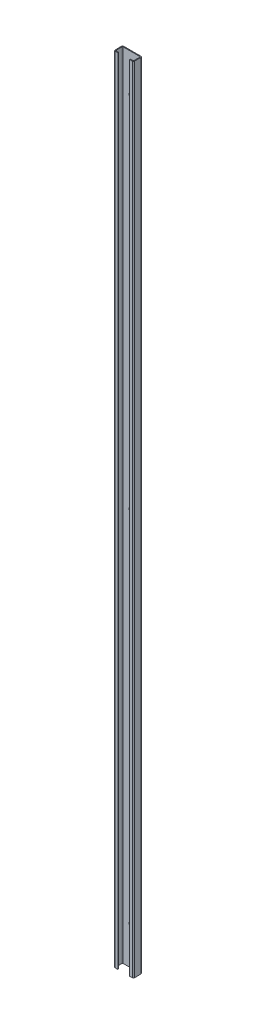
ISO-10303-21;
HEADER;
FILE_DESCRIPTION(('STEP AP214'),'2;1');
FILE_NAME('part.step','',(''),(''),'','','');
FILE_SCHEMA(('AUTOMOTIVE_DESIGN { 1 0 10303 214 1 1 1 1 }'));
ENDSEC;
DATA;
#1=APPLICATION_CONTEXT('core data for automotive mechanical design processes');
#2=APPLICATION_PROTOCOL_DEFINITION('international standard','automotive_design',2000,#1);
#3=PRODUCT_CONTEXT('',#1,'mechanical');
#4=PRODUCT('Part','Part','',(#3));
#5=PRODUCT_RELATED_PRODUCT_CATEGORY('part','',(#4));
#6=PRODUCT_DEFINITION_FORMATION('','',#4);
#7=PRODUCT_DEFINITION_CONTEXT('part definition',#1,'design');
#8=PRODUCT_DEFINITION('design','',#6,#7);
#9=PRODUCT_DEFINITION_SHAPE('','',#8);
#10=(LENGTH_UNIT() NAMED_UNIT(*) SI_UNIT(.MILLI.,.METRE.));
#11=(NAMED_UNIT(*) PLANE_ANGLE_UNIT() SI_UNIT($,.RADIAN.));
#12=(NAMED_UNIT(*) SI_UNIT($,.STERADIAN.) SOLID_ANGLE_UNIT());
#13=UNCERTAINTY_MEASURE_WITH_UNIT(LENGTH_MEASURE(1.E-05),#10,'distance_accuracy_value','');
#14=(GEOMETRIC_REPRESENTATION_CONTEXT(3) GLOBAL_UNCERTAINTY_ASSIGNED_CONTEXT((#13)) GLOBAL_UNIT_ASSIGNED_CONTEXT((#10,
#11,#12)) REPRESENTATION_CONTEXT('',''));
#15=CARTESIAN_POINT('',(0.,0.,0.));
#16=DIRECTION('',(0.,0.,1.));
#17=DIRECTION('',(1.,0.,0.));
#18=AXIS2_PLACEMENT_3D('',#15,#16,#17);
#19=CARTESIAN_POINT('',(25.,1023.5,22.));
#20=DIRECTION('',(0.,1.,0.));
#21=DIRECTION('',(-1.,0.,0.));
#22=AXIS2_PLACEMENT_3D('',#19,#20,#21);
#23=PLANE('',#22);
#24=DIRECTION('',(0.,0.,-1.));
#25=VECTOR('',#24,1.);
#26=CARTESIAN_POINT('',(22.9999999999999,1023.5,0.));
#27=LINE('',#26,#25);
#28=CARTESIAN_POINT('',(22.9999999999999,1023.5,19.));
#29=VERTEX_POINT('',#28);
#30=CARTESIAN_POINT('',(23.0000000000001,1023.5,3.00000000000004));
#31=VERTEX_POINT('',#30);
#32=EDGE_CURVE('E427',#29,#31,#27,.T.);
#33=ORIENTED_EDGE('',*,*,#32,.F.);
#34=DIRECTION('',(1.,0.,0.));
#35=VECTOR('',#34,1.);
#36=CARTESIAN_POINT('',(23.0000000000001,1023.5,19.));
#37=LINE('',#36,#35);
#38=CARTESIAN_POINT('',(25.0000000000001,1023.5,19.));
#39=VERTEX_POINT('',#38);
#40=EDGE_CURVE('E313',#29,#39,#37,.T.);
#41=ORIENTED_EDGE('',*,*,#40,.T.);
#42=DIRECTION('',(0.,0.,1.));
#43=VECTOR('',#42,1.);
#44=CARTESIAN_POINT('',(25.,1023.5,22.));
#45=LINE('',#44,#43);
#46=CARTESIAN_POINT('',(24.9999999999999,1023.5,3.00000000000007));
#47=VERTEX_POINT('',#46);
#48=EDGE_CURVE('E421',#39,#47,#45,.F.);
#49=ORIENTED_EDGE('',*,*,#48,.T.);
#50=DIRECTION('',(1.,0.,0.));
#51=VECTOR('',#50,1.);
#52=CARTESIAN_POINT('',(22.9999999999999,1023.5,3.00000000000007));
#53=LINE('',#52,#51);
#54=EDGE_CURVE('E433',#31,#47,#53,.T.);
#55=ORIENTED_EDGE('',*,*,#54,.F.);
#56=EDGE_LOOP('',(#33,#41,#49,#55));
#57=FACE_BOUND('',#56,.T.);
#58=ADVANCED_FACE('F119',(#57),#23,.T.);
#59=CARTESIAN_POINT('',(25.,0.,0.));
#60=DIRECTION('',(-1.,0.,0.));
#61=DIRECTION('',(0.,0.,1.));
#62=AXIS2_PLACEMENT_3D('',#59,#60,#61);
#63=PLANE('',#62);
#64=DIRECTION('',(0.,1.,0.));
#65=VECTOR('',#64,1.);
#66=CARTESIAN_POINT('',(25.0000000000001,1023.5,19.));
#67=LINE('',#66,#65);
#68=CARTESIAN_POINT('',(25.0000000000002,-1023.5,19.));
#69=VERTEX_POINT('',#68);
#70=EDGE_CURVE('E266',#39,#69,#67,.F.);
#71=ORIENTED_EDGE('',*,*,#70,.T.);
#72=DIRECTION('',(0.,0.,-1.));
#73=VECTOR('',#72,1.);
#74=CARTESIAN_POINT('',(25.0000000000001,-1023.5,1.99999999999999));
#75=LINE('',#74,#73);
#76=CARTESIAN_POINT('',(25.0000000000001,-1023.5,3.00000000000003));
#77=VERTEX_POINT('',#76);
#78=EDGE_CURVE('E424',#77,#69,#75,.F.);
#79=ORIENTED_EDGE('',*,*,#78,.F.);
#80=DIRECTION('',(0.,1.,0.));
#81=VECTOR('',#80,1.);
#82=CARTESIAN_POINT('',(25.0000000000001,-1023.5,2.99999999999999));
#83=LINE('',#82,#81);
#84=EDGE_CURVE('E431',#47,#77,#83,.F.);
#85=ORIENTED_EDGE('',*,*,#84,.F.);
#86=ORIENTED_EDGE('',*,*,#48,.F.);
#87=EDGE_LOOP('',(#71,#79,#85,#86));
#88=FACE_BOUND('',#87,.T.);
#89=ADVANCED_FACE('F549',(#88),#63,.F.);
#90=CARTESIAN_POINT('',(23.,0.,0.));
#91=DIRECTION('',(-1.,0.,0.));
#92=DIRECTION('',(0.,0.,1.));
#93=AXIS2_PLACEMENT_3D('',#90,#91,#92);
#94=PLANE('',#93);
#95=DIRECTION('',(0.,0.,1.));
#96=VECTOR('',#95,1.);
#97=CARTESIAN_POINT('',(23.0000000000001,-1023.5,0.));
#98=LINE('',#97,#96);
#99=CARTESIAN_POINT('',(23.0000000000001,-1023.5,3.00000000000004));
#100=VERTEX_POINT('',#99);
#101=CARTESIAN_POINT('',(23.0000000000001,-1023.5,19.));
#102=VERTEX_POINT('',#101);
#103=EDGE_CURVE('E429',#100,#102,#98,.T.);
#104=ORIENTED_EDGE('',*,*,#103,.T.);
#105=DIRECTION('',(0.,1.,0.));
#106=VECTOR('',#105,1.);
#107=CARTESIAN_POINT('',(23.0000000000001,1023.5,19.));
#108=LINE('',#107,#106);
#109=EDGE_CURVE('E136',#29,#102,#108,.F.);
#110=ORIENTED_EDGE('',*,*,#109,.F.);
#111=ORIENTED_EDGE('',*,*,#32,.T.);
#112=DIRECTION('',(0.,1.,0.));
#113=VECTOR('',#112,1.);
#114=CARTESIAN_POINT('',(23.0000000000001,-1023.5,3.));
#115=LINE('',#114,#113);
#116=EDGE_CURVE('E436',#100,#31,#115,.T.);
#117=ORIENTED_EDGE('',*,*,#116,.F.);
#118=EDGE_LOOP('',(#104,#110,#111,#117));
#119=FACE_BOUND('',#118,.T.);
#120=ADVANCED_FACE('F555',(#119),#94,.T.);
#121=CARTESIAN_POINT('',(-24.9999999999999,-1023.5,1.99999999999999));
#122=DIRECTION('',(0.,-1.,0.));
#123=DIRECTION('',(1.,0.,0.));
#124=AXIS2_PLACEMENT_3D('',#121,#122,#123);
#125=PLANE('',#124);
#126=DIRECTION('',(0.,0.,1.));
#127=VECTOR('',#126,1.);
#128=CARTESIAN_POINT('',(-22.9999999999999,-1023.5,0.));
#129=LINE('',#128,#127);
#130=CARTESIAN_POINT('',(-23.0000000000002,-1023.5,19.));
#131=VERTEX_POINT('',#130);
#132=CARTESIAN_POINT('',(-23.0000000000001,-1023.5,3.00000000000004));
#133=VERTEX_POINT('',#132);
#134=EDGE_CURVE('E385',#131,#133,#129,.F.);
#135=ORIENTED_EDGE('',*,*,#134,.F.);
#136=DIRECTION('',(-1.,0.,-1.28369537222268E-13));
#137=VECTOR('',#136,1.);
#138=CARTESIAN_POINT('',(-23.0000000000002,-1023.5,19.));
#139=LINE('',#138,#137);
#140=CARTESIAN_POINT('',(-25.0000000000002,-1023.5,18.9999999999998));
#141=VERTEX_POINT('',#140);
#142=EDGE_CURVE('E361',#131,#141,#139,.T.);
#143=ORIENTED_EDGE('',*,*,#142,.T.);
#144=DIRECTION('',(0.,0.,-1.));
#145=VECTOR('',#144,1.);
#146=CARTESIAN_POINT('',(-24.9999999999999,-1023.5,1.99999999999999));
#147=LINE('',#146,#145);
#148=CARTESIAN_POINT('',(-24.9999999999999,-1023.5,3.00000000000008));
#149=VERTEX_POINT('',#148);
#150=EDGE_CURVE('E380',#141,#149,#147,.T.);
#151=ORIENTED_EDGE('',*,*,#150,.T.);
#152=DIRECTION('',(-1.,0.,0.));
#153=VECTOR('',#152,1.);
#154=CARTESIAN_POINT('',(-22.9999999999999,-1023.5,3.00000000000009));
#155=LINE('',#154,#153);
#156=EDGE_CURVE('E390',#133,#149,#155,.T.);
#157=ORIENTED_EDGE('',*,*,#156,.F.);
#158=EDGE_LOOP('',(#135,#143,#151,#157));
#159=FACE_BOUND('',#158,.T.);
#160=ADVANCED_FACE('F510',(#159),#125,.T.);
#161=CARTESIAN_POINT('',(-25.,0.,0.));
#162=DIRECTION('',(-1.,0.,0.));
#163=DIRECTION('',(0.,0.,1.));
#164=AXIS2_PLACEMENT_3D('',#161,#162,#163);
#165=PLANE('',#164);
#166=ORIENTED_EDGE('',*,*,#150,.F.);
#167=DIRECTION('',(0.,-1.,0.));
#168=VECTOR('',#167,1.);
#169=CARTESIAN_POINT('',(-25.0000000000002,-1023.5,18.9999999999998));
#170=LINE('',#169,#168);
#171=CARTESIAN_POINT('',(-25.0000000000002,1023.5,19.));
#172=VERTEX_POINT('',#171);
#173=EDGE_CURVE('E356',#141,#172,#170,.F.);
#174=ORIENTED_EDGE('',*,*,#173,.T.);
#175=DIRECTION('',(0.,0.,1.));
#176=VECTOR('',#175,1.);
#177=CARTESIAN_POINT('',(-25.0000000000002,1023.5,22.0000000000002));
#178=LINE('',#177,#176);
#179=CARTESIAN_POINT('',(-25.0000000000001,1023.5,3.00000000000004));
#180=VERTEX_POINT('',#179);
#181=EDGE_CURVE('E376',#180,#172,#178,.T.);
#182=ORIENTED_EDGE('',*,*,#181,.F.);
#183=DIRECTION('',(0.,-1.,0.));
#184=VECTOR('',#183,1.);
#185=CARTESIAN_POINT('',(-25.,0.,3.00000000000004));
#186=LINE('',#185,#184);
#187=EDGE_CURVE('E387',#180,#149,#186,.T.);
#188=ORIENTED_EDGE('',*,*,#187,.T.);
#189=EDGE_LOOP('',(#166,#174,#182,#188));
#190=FACE_BOUND('',#189,.T.);
#191=ADVANCED_FACE('F502',(#190),#165,.T.);
#192=CARTESIAN_POINT('',(-23.,0.,0.));
#193=DIRECTION('',(-1.,0.,0.));
#194=DIRECTION('',(0.,0.,1.));
#195=AXIS2_PLACEMENT_3D('',#192,#193,#194);
#196=PLANE('',#195);
#197=DIRECTION('',(0.,-1.,0.));
#198=VECTOR('',#197,1.);
#199=CARTESIAN_POINT('',(-23.0000000000002,-1023.5,19.));
#200=LINE('',#199,#198);
#201=CARTESIAN_POINT('',(-23.0000000000002,1023.5,19.));
#202=VERTEX_POINT('',#201);
#203=EDGE_CURVE('E367',#131,#202,#200,.F.);
#204=ORIENTED_EDGE('',*,*,#203,.F.);
#205=ORIENTED_EDGE('',*,*,#134,.T.);
#206=DIRECTION('',(0.,1.,0.));
#207=VECTOR('',#206,1.);
#208=CARTESIAN_POINT('',(-23.0000000000001,1023.5,3.));
#209=LINE('',#208,#207);
#210=CARTESIAN_POINT('',(-23.0000000000001,1023.5,3.00000000000004));
#211=VERTEX_POINT('',#210);
#212=EDGE_CURVE('E393',#211,#133,#209,.F.);
#213=ORIENTED_EDGE('',*,*,#212,.F.);
#214=DIRECTION('',(0.,0.,-1.));
#215=VECTOR('',#214,1.);
#216=CARTESIAN_POINT('',(-23.0000000000001,1023.5,0.));
#217=LINE('',#216,#215);
#218=EDGE_CURVE('E382',#211,#202,#217,.F.);
#219=ORIENTED_EDGE('',*,*,#218,.T.);
#220=EDGE_LOOP('',(#204,#205,#213,#219));
#221=FACE_BOUND('',#220,.T.);
#222=ADVANCED_FACE('F513',(#221),#196,.F.);
#223=CARTESIAN_POINT('',(25.0000000000001,-1023.5,2.));
#224=DIRECTION('',(0.,1.,0.));
#225=DIRECTION('',(0.,0.,1.));
#226=AXIS2_PLACEMENT_3D('',#223,#224,#225);
#227=PLANE('',#226);
#228=DIRECTION('',(1.24900090270314E-13,0.,-1.));
#229=VECTOR('',#228,1.);
#230=CARTESIAN_POINT('',(-21.9999999999999,-1023.5,1.99999999999992));
#231=LINE('',#230,#229);
#232=CARTESIAN_POINT('',(-21.9999999999999,-1023.5,1.99999999999992));
#233=VERTEX_POINT('',#232);
#234=CARTESIAN_POINT('',(-21.9999999999996,-1023.5,0.));
#235=VERTEX_POINT('',#234);
#236=EDGE_CURVE('E405',#233,#235,#231,.T.);
#237=ORIENTED_EDGE('',*,*,#236,.T.);
#238=DIRECTION('',(1.,0.,0.));
#239=VECTOR('',#238,1.);
#240=CARTESIAN_POINT('',(25.0000000000001,-1023.5,0.));
#241=LINE('',#240,#239);
#242=CARTESIAN_POINT('',(21.9999999999999,-1023.5,0.));
#243=VERTEX_POINT('',#242);
#244=EDGE_CURVE('E461',#235,#243,#241,.T.);
#245=ORIENTED_EDGE('',*,*,#244,.T.);
#246=DIRECTION('',(-1.24900090270314E-13,0.,-1.));
#247=VECTOR('',#246,1.);
#248=CARTESIAN_POINT('',(21.9999999999999,-1023.5,1.99999999999991));
#249=LINE('',#248,#247);
#250=CARTESIAN_POINT('',(21.9999999999999,-1023.5,1.99999999999991));
#251=VERTEX_POINT('',#250);
#252=EDGE_CURVE('E458',#251,#243,#249,.T.);
#253=ORIENTED_EDGE('',*,*,#252,.F.);
#254=DIRECTION('',(1.,0.,0.));
#255=VECTOR('',#254,1.);
#256=CARTESIAN_POINT('',(25.0000000000001,-1023.5,2.));
#257=LINE('',#256,#255);
#258=EDGE_CURVE('E128',#233,#251,#257,.T.);
#259=ORIENTED_EDGE('',*,*,#258,.F.);
#260=EDGE_LOOP('',(#237,#245,#253,#259));
#261=FACE_BOUND('',#260,.T.);
#262=ADVANCED_FACE('F121',(#261),#227,.F.);
#263=CARTESIAN_POINT('',(24.9999999999999,1023.5,2.));
#264=DIRECTION('',(0.,-1.,0.));
#265=DIRECTION('',(0.,0.,-1.));
#266=AXIS2_PLACEMENT_3D('',#263,#264,#265);
#267=PLANE('',#266);
#268=DIRECTION('',(1.24900090270314E-13,0.,-1.));
#269=VECTOR('',#268,1.);
#270=CARTESIAN_POINT('',(-21.9999999999999,1023.5,1.99999999999992));
#271=LINE('',#270,#269);
#272=CARTESIAN_POINT('',(-21.9999999999999,1023.5,1.99999999999992));
#273=VERTEX_POINT('',#272);
#274=CARTESIAN_POINT('',(-21.9999999999999,1023.5,0.));
#275=VERTEX_POINT('',#274);
#276=EDGE_CURVE('E415',#273,#275,#271,.T.);
#277=ORIENTED_EDGE('',*,*,#276,.F.);
#278=DIRECTION('',(-1.,0.,0.));
#279=VECTOR('',#278,1.);
#280=CARTESIAN_POINT('',(24.9999999999999,1023.5,2.));
#281=LINE('',#280,#279);
#282=CARTESIAN_POINT('',(21.9999999999999,1023.5,1.99999999999991));
#283=VERTEX_POINT('',#282);
#284=EDGE_CURVE('E13',#283,#273,#281,.T.);
#285=ORIENTED_EDGE('',*,*,#284,.F.);
#286=DIRECTION('',(-1.24900090270314E-13,0.,-1.));
#287=VECTOR('',#286,1.);
#288=CARTESIAN_POINT('',(21.9999999999999,1023.5,1.99999999999991));
#289=LINE('',#288,#287);
#290=CARTESIAN_POINT('',(21.9999999999996,1023.5,0.));
#291=VERTEX_POINT('',#290);
#292=EDGE_CURVE('E448',#283,#291,#289,.T.);
#293=ORIENTED_EDGE('',*,*,#292,.T.);
#294=DIRECTION('',(-1.,0.,0.));
#295=VECTOR('',#294,1.);
#296=CARTESIAN_POINT('',(24.9999999999999,1023.5,0.));
#297=LINE('',#296,#295);
#298=EDGE_CURVE('E123',#291,#275,#297,.T.);
#299=ORIENTED_EDGE('',*,*,#298,.T.);
#300=EDGE_LOOP('',(#277,#285,#293,#299));
#301=FACE_BOUND('',#300,.T.);
#302=ADVANCED_FACE('F473',(#301),#267,.F.);
#303=CARTESIAN_POINT('',(0.,0.,2.));
#304=DIRECTION('',(0.,0.,-1.));
#305=DIRECTION('',(-1.,0.,0.));
#306=AXIS2_PLACEMENT_3D('',#303,#304,#305);
#307=PLANE('',#306);
#308=CARTESIAN_POINT('',(-2.00000000000015,-925.5,2.));
#309=DIRECTION('',(0.,0.,-1.));
#310=DIRECTION('',(-1.,0.,0.));
#311=AXIS2_PLACEMENT_3D('',#308,#309,#310);
#312=CIRCLE('',#311,4.60000000000005);
#313=CARTESIAN_POINT('',(-6.6000000000002,-925.5,2.));
#314=VERTEX_POINT('',#313);
#315=EDGE_CURVE('E1001',#314,#314,#312,.F.);
#316=ORIENTED_EDGE('',*,*,#315,.F.);
#317=EDGE_LOOP('',(#316));
#318=FACE_BOUND('',#317,.T.);
#319=CARTESIAN_POINT('',(-2.00000000000015,0.,2.));
#320=DIRECTION('',(0.,0.,-1.));
#321=DIRECTION('',(-1.,0.,0.));
#322=AXIS2_PLACEMENT_3D('',#319,#320,#321);
#323=CIRCLE('',#322,4.6);
#324=CARTESIAN_POINT('',(-6.60000000000015,0.,2.));
#325=VERTEX_POINT('',#324);
#326=EDGE_CURVE('E995',#325,#325,#323,.F.);
#327=ORIENTED_EDGE('',*,*,#326,.F.);
#328=EDGE_LOOP('',(#327));
#329=FACE_BOUND('',#328,.T.);
#330=CARTESIAN_POINT('',(-2.00000000000015,925.5,2.));
#331=DIRECTION('',(0.,0.,-1.));
#332=DIRECTION('',(-1.,0.,0.));
#333=AXIS2_PLACEMENT_3D('',#330,#331,#332);
#334=CIRCLE('',#333,4.60000000000005);
#335=CARTESIAN_POINT('',(-6.6000000000002,925.5,2.));
#336=VERTEX_POINT('',#335);
#337=EDGE_CURVE('E310',#336,#336,#334,.F.);
#338=ORIENTED_EDGE('',*,*,#337,.F.);
#339=EDGE_LOOP('',(#338));
#340=FACE_BOUND('',#339,.T.);
#341=DIRECTION('',(0.,-1.,0.));
#342=VECTOR('',#341,1.);
#343=CARTESIAN_POINT('',(-21.9999999999999,-1023.5,1.99999999999992));
#344=LINE('',#343,#342);
#345=EDGE_CURVE('E411',#233,#273,#344,.F.);
#346=ORIENTED_EDGE('',*,*,#345,.F.);
#347=ORIENTED_EDGE('',*,*,#258,.T.);
#348=DIRECTION('',(0.,1.,0.));
#349=VECTOR('',#348,1.);
#350=CARTESIAN_POINT('',(21.9999999999999,1023.5,1.99999999999991));
#351=LINE('',#350,#349);
#352=EDGE_CURVE('E454',#283,#251,#351,.F.);
#353=ORIENTED_EDGE('',*,*,#352,.F.);
#354=ORIENTED_EDGE('',*,*,#284,.T.);
#355=EDGE_LOOP('',(#346,#347,#353,#354));
#356=FACE_BOUND('',#355,.T.);
#357=ADVANCED_FACE('F488',(#318,#329,#340,#356),#307,.F.);
#358=CARTESIAN_POINT('',(0.,0.,0.));
#359=DIRECTION('',(0.,0.,-1.));
#360=DIRECTION('',(-1.,0.,0.));
#361=AXIS2_PLACEMENT_3D('',#358,#359,#360);
#362=PLANE('',#361);
#363=CARTESIAN_POINT('',(-2.00000000000015,-925.5,0.));
#364=DIRECTION('',(0.,0.,1.));
#365=DIRECTION('',(1.,0.,0.));
#366=AXIS2_PLACEMENT_3D('',#363,#364,#365);
#367=CIRCLE('',#366,4.60000000000005);
#368=CARTESIAN_POINT('',(2.5999999999999,-925.5,0.));
#369=VERTEX_POINT('',#368);
#370=EDGE_CURVE('E1004',#369,#369,#367,.T.);
#371=ORIENTED_EDGE('',*,*,#370,.T.);
#372=EDGE_LOOP('',(#371));
#373=FACE_BOUND('',#372,.T.);
#374=CARTESIAN_POINT('',(-2.00000000000015,0.,0.));
#375=DIRECTION('',(0.,0.,1.));
#376=DIRECTION('',(1.,0.,0.));
#377=AXIS2_PLACEMENT_3D('',#374,#375,#376);
#378=CIRCLE('',#377,4.6);
#379=CARTESIAN_POINT('',(2.59999999999985,0.,0.));
#380=VERTEX_POINT('',#379);
#381=EDGE_CURVE('E998',#380,#380,#378,.T.);
#382=ORIENTED_EDGE('',*,*,#381,.T.);
#383=EDGE_LOOP('',(#382));
#384=FACE_BOUND('',#383,.T.);
#385=CARTESIAN_POINT('',(-2.00000000000015,925.5,0.));
#386=DIRECTION('',(0.,0.,1.));
#387=DIRECTION('',(1.,0.,0.));
#388=AXIS2_PLACEMENT_3D('',#385,#386,#387);
#389=CIRCLE('',#388,4.60000000000005);
#390=CARTESIAN_POINT('',(2.5999999999999,925.5,0.));
#391=VERTEX_POINT('',#390);
#392=EDGE_CURVE('E992',#391,#391,#389,.T.);
#393=ORIENTED_EDGE('',*,*,#392,.T.);
#394=EDGE_LOOP('',(#393));
#395=FACE_BOUND('',#394,.T.);
#396=ORIENTED_EDGE('',*,*,#244,.F.);
#397=DIRECTION('',(0.,-1.,0.));
#398=VECTOR('',#397,1.);
#399=CARTESIAN_POINT('',(-21.9999999999996,-1023.5,0.));
#400=LINE('',#399,#398);
#401=EDGE_CURVE('E398',#235,#275,#400,.F.);
#402=ORIENTED_EDGE('',*,*,#401,.T.);
#403=ORIENTED_EDGE('',*,*,#298,.F.);
#404=DIRECTION('',(0.,1.,0.));
#405=VECTOR('',#404,1.);
#406=CARTESIAN_POINT('',(21.9999999999996,1023.5,0.));
#407=LINE('',#406,#405);
#408=EDGE_CURVE('E441',#291,#243,#407,.F.);
#409=ORIENTED_EDGE('',*,*,#408,.T.);
#410=EDGE_LOOP('',(#396,#402,#403,#409));
#411=FACE_BOUND('',#410,.T.);
#412=ADVANCED_FACE('F476',(#373,#384,#395,#411),#362,.T.);
#413=CARTESIAN_POINT('',(22.,-1023.5,3.00000000000004));
#414=DIRECTION('',(0.,-1.,0.));
#415=DIRECTION('',(0.,0.,-1.));
#416=AXIS2_PLACEMENT_3D('',#413,#414,#415);
#417=PLANE('',#416);
#418=DIRECTION('',(1.,0.,0.));
#419=VECTOR('',#418,1.);
#420=CARTESIAN_POINT('',(25.0000000000001,-1023.5,2.99999999999999));
#421=LINE('',#420,#419);
#422=EDGE_CURVE('E418',#100,#77,#421,.T.);
#423=ORIENTED_EDGE('',*,*,#422,.F.);
#424=CARTESIAN_POINT('',(22.,-1023.5,3.00000000000004));
#425=DIRECTION('',(0.,1.,0.));
#426=DIRECTION('',(0.,0.,1.));
#427=AXIS2_PLACEMENT_3D('',#424,#425,#426);
#428=CIRCLE('',#427,1.00000000000013);
#429=EDGE_CURVE('E451',#251,#100,#428,.F.);
#430=ORIENTED_EDGE('',*,*,#429,.F.);
#431=ORIENTED_EDGE('',*,*,#252,.T.);
#432=CARTESIAN_POINT('',(22.,-1023.5,3.00000000000004));
#433=DIRECTION('',(0.,1.,0.));
#434=DIRECTION('',(0.,0.,1.));
#435=AXIS2_PLACEMENT_3D('',#432,#433,#434);
#436=CIRCLE('',#435,3.00000000000013);
#437=EDGE_CURVE('E444',#243,#77,#436,.F.);
#438=ORIENTED_EDGE('',*,*,#437,.T.);
#439=EDGE_LOOP('',(#423,#430,#431,#438));
#440=FACE_BOUND('',#439,.T.);
#441=ADVANCED_FACE('F573',(#440),#417,.T.);
#442=CARTESIAN_POINT('',(22.,1023.5,3.00000000000004));
#443=DIRECTION('',(0.,-1.,0.));
#444=DIRECTION('',(0.,0.,-1.));
#445=AXIS2_PLACEMENT_3D('',#442,#443,#444);
#446=PLANE('',#445);
#447=CARTESIAN_POINT('',(22.,1023.5,3.00000000000004));
#448=DIRECTION('',(0.,1.,0.));
#449=DIRECTION('',(0.,0.,1.));
#450=AXIS2_PLACEMENT_3D('',#447,#448,#449);
#451=CIRCLE('',#450,1.00000000000013);
#452=EDGE_CURVE('E423',#31,#283,#451,.T.);
#453=ORIENTED_EDGE('',*,*,#452,.F.);
#454=ORIENTED_EDGE('',*,*,#54,.T.);
#455=CARTESIAN_POINT('',(22.,1023.5,3.00000000000004));
#456=DIRECTION('',(0.,1.,0.));
#457=DIRECTION('',(0.,0.,1.));
#458=AXIS2_PLACEMENT_3D('',#455,#456,#457);
#459=CIRCLE('',#458,3.00000000000013);
#460=EDGE_CURVE('E445',#47,#291,#459,.T.);
#461=ORIENTED_EDGE('',*,*,#460,.T.);
#462=ORIENTED_EDGE('',*,*,#292,.F.);
#463=EDGE_LOOP('',(#453,#454,#461,#462));
#464=FACE_BOUND('',#463,.T.);
#465=ADVANCED_FACE('F568',(#464),#446,.F.);
#466=CARTESIAN_POINT('',(22.,1023.5,3.00000000000004));
#467=DIRECTION('',(0.,1.,0.));
#468=DIRECTION('',(1.,0.,0.));
#469=AXIS2_PLACEMENT_3D('',#466,#467,#468);
#470=CYLINDRICAL_SURFACE('',#469,3.00000000000013);
#471=ORIENTED_EDGE('',*,*,#408,.F.);
#472=ORIENTED_EDGE('',*,*,#460,.F.);
#473=ORIENTED_EDGE('',*,*,#84,.T.);
#474=ORIENTED_EDGE('',*,*,#437,.F.);
#475=EDGE_LOOP('',(#471,#472,#473,#474));
#476=FACE_BOUND('',#475,.T.);
#477=ADVANCED_FACE('F565',(#476),#470,.T.);
#478=CARTESIAN_POINT('',(22.,1023.5,3.00000000000004));
#479=DIRECTION('',(0.,1.,0.));
#480=DIRECTION('',(1.,0.,0.));
#481=AXIS2_PLACEMENT_3D('',#478,#479,#480);
#482=CYLINDRICAL_SURFACE('',#481,1.00000000000013);
#483=ORIENTED_EDGE('',*,*,#352,.T.);
#484=ORIENTED_EDGE('',*,*,#429,.T.);
#485=ORIENTED_EDGE('',*,*,#116,.T.);
#486=ORIENTED_EDGE('',*,*,#452,.T.);
#487=EDGE_LOOP('',(#483,#484,#485,#486));
#488=FACE_BOUND('',#487,.T.);
#489=ADVANCED_FACE('F563',(#488),#482,.F.);
#490=CARTESIAN_POINT('',(25.0000000000001,-1023.5,1.99999999999999));
#491=DIRECTION('',(0.,-1.,0.));
#492=DIRECTION('',(1.,0.,0.));
#493=AXIS2_PLACEMENT_3D('',#490,#491,#492);
#494=PLANE('',#493);
#495=DIRECTION('',(1.,0.,0.));
#496=VECTOR('',#495,1.);
#497=CARTESIAN_POINT('',(23.0000000000001,-1023.5,19.));
#498=LINE('',#497,#496);
#499=EDGE_CURVE('E319',#102,#69,#498,.T.);
#500=ORIENTED_EDGE('',*,*,#499,.F.);
#501=ORIENTED_EDGE('',*,*,#103,.F.);
#502=ORIENTED_EDGE('',*,*,#422,.T.);
#503=ORIENTED_EDGE('',*,*,#78,.T.);
#504=EDGE_LOOP('',(#500,#501,#502,#503));
#505=FACE_BOUND('',#504,.T.);
#506=ADVANCED_FACE('F560',(#505),#494,.T.);
#507=CARTESIAN_POINT('',(-22.,1023.5,3.00000000000005));
#508=DIRECTION('',(0.,1.,0.));
#509=DIRECTION('',(0.,0.,1.));
#510=AXIS2_PLACEMENT_3D('',#507,#508,#509);
#511=PLANE('',#510);
#512=DIRECTION('',(-1.,0.,0.));
#513=VECTOR('',#512,1.);
#514=CARTESIAN_POINT('',(-25.0000000000001,1023.5,2.99999999999999));
#515=LINE('',#514,#513);
#516=EDGE_CURVE('E373',#211,#180,#515,.T.);
#517=ORIENTED_EDGE('',*,*,#516,.F.);
#518=CARTESIAN_POINT('',(-22.,1023.5,3.00000000000005));
#519=DIRECTION('',(0.,-1.,0.));
#520=DIRECTION('',(0.,0.,-1.));
#521=AXIS2_PLACEMENT_3D('',#518,#519,#520);
#522=CIRCLE('',#521,1.00000000000013);
#523=EDGE_CURVE('E408',#273,#211,#522,.F.);
#524=ORIENTED_EDGE('',*,*,#523,.F.);
#525=ORIENTED_EDGE('',*,*,#276,.T.);
#526=CARTESIAN_POINT('',(-22.,1023.5,3.00000000000005));
#527=DIRECTION('',(0.,-1.,0.));
#528=DIRECTION('',(0.,0.,-1.));
#529=AXIS2_PLACEMENT_3D('',#526,#527,#528);
#530=CIRCLE('',#529,3.00000000000013);
#531=EDGE_CURVE('E401',#275,#180,#530,.F.);
#532=ORIENTED_EDGE('',*,*,#531,.T.);
#533=EDGE_LOOP('',(#517,#524,#525,#532));
#534=FACE_BOUND('',#533,.T.);
#535=ADVANCED_FACE('F494',(#534),#511,.T.);
#536=CARTESIAN_POINT('',(-22.,-1023.5,3.00000000000005));
#537=DIRECTION('',(0.,1.,0.));
#538=DIRECTION('',(0.,0.,1.));
#539=AXIS2_PLACEMENT_3D('',#536,#537,#538);
#540=PLANE('',#539);
#541=CARTESIAN_POINT('',(-22.,-1023.5,3.00000000000005));
#542=DIRECTION('',(0.,-1.,0.));
#543=DIRECTION('',(0.,0.,-1.));
#544=AXIS2_PLACEMENT_3D('',#541,#542,#543);
#545=CIRCLE('',#544,1.00000000000013);
#546=EDGE_CURVE('E379',#133,#233,#545,.T.);
#547=ORIENTED_EDGE('',*,*,#546,.F.);
#548=ORIENTED_EDGE('',*,*,#156,.T.);
#549=CARTESIAN_POINT('',(-22.,-1023.5,3.00000000000005));
#550=DIRECTION('',(0.,-1.,0.));
#551=DIRECTION('',(0.,0.,-1.));
#552=AXIS2_PLACEMENT_3D('',#549,#550,#551);
#553=CIRCLE('',#552,3.00000000000013);
#554=EDGE_CURVE('E402',#149,#235,#553,.T.);
#555=ORIENTED_EDGE('',*,*,#554,.T.);
#556=ORIENTED_EDGE('',*,*,#236,.F.);
#557=EDGE_LOOP('',(#547,#548,#555,#556));
#558=FACE_BOUND('',#557,.T.);
#559=ADVANCED_FACE('F482',(#558),#540,.F.);
#560=CARTESIAN_POINT('',(-22.,-1023.5,3.00000000000005));
#561=DIRECTION('',(0.,-1.,0.));
#562=DIRECTION('',(-1.,0.,0.));
#563=AXIS2_PLACEMENT_3D('',#560,#561,#562);
#564=CYLINDRICAL_SURFACE('',#563,3.00000000000013);
#565=ORIENTED_EDGE('',*,*,#401,.F.);
#566=ORIENTED_EDGE('',*,*,#554,.F.);
#567=ORIENTED_EDGE('',*,*,#187,.F.);
#568=ORIENTED_EDGE('',*,*,#531,.F.);
#569=EDGE_LOOP('',(#565,#566,#567,#568));
#570=FACE_BOUND('',#569,.T.);
#571=ADVANCED_FACE('F479',(#570),#564,.T.);
#572=CARTESIAN_POINT('',(-22.,-1023.5,3.00000000000005));
#573=DIRECTION('',(0.,-1.,0.));
#574=DIRECTION('',(-1.,0.,0.));
#575=AXIS2_PLACEMENT_3D('',#572,#573,#574);
#576=CYLINDRICAL_SURFACE('',#575,1.00000000000013);
#577=ORIENTED_EDGE('',*,*,#345,.T.);
#578=ORIENTED_EDGE('',*,*,#523,.T.);
#579=ORIENTED_EDGE('',*,*,#212,.T.);
#580=ORIENTED_EDGE('',*,*,#546,.T.);
#581=EDGE_LOOP('',(#577,#578,#579,#580));
#582=FACE_BOUND('',#581,.T.);
#583=ADVANCED_FACE('F491',(#582),#576,.F.);
#584=CARTESIAN_POINT('',(-25.0000000000002,1023.5,22.0000000000002));
#585=DIRECTION('',(0.,1.,0.));
#586=DIRECTION('',(-1.,0.,0.));
#587=AXIS2_PLACEMENT_3D('',#584,#585,#586);
#588=PLANE('',#587);
#589=DIRECTION('',(-1.,0.,-1.28369537222268E-13));
#590=VECTOR('',#589,1.);
#591=CARTESIAN_POINT('',(-23.0000000000002,1023.5,19.));
#592=LINE('',#591,#590);
#593=EDGE_CURVE('E371',#202,#172,#592,.T.);
#594=ORIENTED_EDGE('',*,*,#593,.F.);
#595=ORIENTED_EDGE('',*,*,#218,.F.);
#596=ORIENTED_EDGE('',*,*,#516,.T.);
#597=ORIENTED_EDGE('',*,*,#181,.T.);
#598=EDGE_LOOP('',(#594,#595,#596,#597));
#599=FACE_BOUND('',#598,.T.);
#600=ADVANCED_FACE('F499',(#599),#588,.T.);
#601=CARTESIAN_POINT('',(-22.,1023.5,19.0000000000001));
#602=DIRECTION('',(0.,1.,0.));
#603=DIRECTION('',(0.,0.,1.));
#604=AXIS2_PLACEMENT_3D('',#601,#602,#603);
#605=PLANE('',#604);
#606=DIRECTION('',(0.,0.,-1.));
#607=VECTOR('',#606,1.);
#608=CARTESIAN_POINT('',(-22.0000000000002,1023.5,22.0000000000003));
#609=LINE('',#608,#607);
#610=CARTESIAN_POINT('',(-22.,1023.5,20.0000000000003));
#611=VERTEX_POINT('',#610);
#612=CARTESIAN_POINT('',(-22.,1023.5,22.0000000000003));
#613=VERTEX_POINT('',#612);
#614=EDGE_CURVE('E322',#611,#613,#609,.F.);
#615=ORIENTED_EDGE('',*,*,#614,.F.);
#616=CARTESIAN_POINT('',(-22.,1023.5,19.0000000000001));
#617=DIRECTION('',(0.,-1.,0.));
#618=DIRECTION('',(0.,0.,-1.));
#619=AXIS2_PLACEMENT_3D('',#616,#617,#618);
#620=CIRCLE('',#619,1.00000000000013);
#621=EDGE_CURVE('E364',#202,#611,#620,.F.);
#622=ORIENTED_EDGE('',*,*,#621,.F.);
#623=ORIENTED_EDGE('',*,*,#593,.T.);
#624=CARTESIAN_POINT('',(-22.,1023.5,19.0000000000001));
#625=DIRECTION('',(0.,-1.,0.));
#626=DIRECTION('',(0.,0.,-1.));
#627=AXIS2_PLACEMENT_3D('',#624,#625,#626);
#628=CIRCLE('',#627,3.00000000000013);
#629=EDGE_CURVE('E144',#172,#613,#628,.F.);
#630=ORIENTED_EDGE('',*,*,#629,.T.);
#631=EDGE_LOOP('',(#615,#622,#623,#630));
#632=FACE_BOUND('',#631,.T.);
#633=ADVANCED_FACE('F519',(#632),#605,.T.);
#634=CARTESIAN_POINT('',(-22.,-1023.5,19.0000000000001));
#635=DIRECTION('',(0.,1.,0.));
#636=DIRECTION('',(0.,0.,1.));
#637=AXIS2_PLACEMENT_3D('',#634,#635,#636);
#638=PLANE('',#637);
#639=CARTESIAN_POINT('',(-22.,-1023.5,19.0000000000001));
#640=DIRECTION('',(0.,-1.,0.));
#641=DIRECTION('',(0.,0.,-1.));
#642=AXIS2_PLACEMENT_3D('',#639,#640,#641);
#643=CIRCLE('',#642,1.00000000000013);
#644=CARTESIAN_POINT('',(-22.,-1023.5,20.0000000000003));
#645=VERTEX_POINT('',#644);
#646=EDGE_CURVE('E328',#645,#131,#643,.T.);
#647=ORIENTED_EDGE('',*,*,#646,.F.);
#648=DIRECTION('',(0.,0.,-1.));
#649=VECTOR('',#648,1.);
#650=CARTESIAN_POINT('',(-21.9999999999999,-1023.5,20.));
#651=LINE('',#650,#649);
#652=CARTESIAN_POINT('',(-21.9999999999999,-1023.5,22.));
#653=VERTEX_POINT('',#652);
#654=EDGE_CURVE('E349',#645,#653,#651,.F.);
#655=ORIENTED_EDGE('',*,*,#654,.T.);
#656=CARTESIAN_POINT('',(-22.,-1023.5,19.0000000000001));
#657=DIRECTION('',(0.,-1.,0.));
#658=DIRECTION('',(0.,0.,-1.));
#659=AXIS2_PLACEMENT_3D('',#656,#657,#658);
#660=CIRCLE('',#659,3.00000000000013);
#661=EDGE_CURVE('E359',#653,#141,#660,.T.);
#662=ORIENTED_EDGE('',*,*,#661,.T.);
#663=ORIENTED_EDGE('',*,*,#142,.F.);
#664=EDGE_LOOP('',(#647,#655,#662,#663));
#665=FACE_BOUND('',#664,.T.);
#666=ADVANCED_FACE('F506',(#665),#638,.F.);
#667=CARTESIAN_POINT('',(-22.,-1023.5,19.0000000000001));
#668=DIRECTION('',(0.,-1.,0.));
#669=DIRECTION('',(0.,0.,1.));
#670=AXIS2_PLACEMENT_3D('',#667,#668,#669);
#671=CYLINDRICAL_SURFACE('',#670,3.00000000000013);
#672=ORIENTED_EDGE('',*,*,#173,.F.);
#673=ORIENTED_EDGE('',*,*,#661,.F.);
#674=DIRECTION('',(0.,-1.,0.));
#675=VECTOR('',#674,1.);
#676=CARTESIAN_POINT('',(-22.,0.,22.0000000000001));
#677=LINE('',#676,#675);
#678=EDGE_CURVE('E346',#613,#653,#677,.T.);
#679=ORIENTED_EDGE('',*,*,#678,.F.);
#680=ORIENTED_EDGE('',*,*,#629,.F.);
#681=EDGE_LOOP('',(#672,#673,#679,#680));
#682=FACE_BOUND('',#681,.T.);
#683=ADVANCED_FACE('F503',(#682),#671,.T.);
#684=CARTESIAN_POINT('',(-22.,-1023.5,19.0000000000001));
#685=DIRECTION('',(0.,-1.,0.));
#686=DIRECTION('',(0.,0.,1.));
#687=AXIS2_PLACEMENT_3D('',#684,#685,#686);
#688=CYLINDRICAL_SURFACE('',#687,1.00000000000013);
#689=ORIENTED_EDGE('',*,*,#203,.T.);
#690=ORIENTED_EDGE('',*,*,#621,.T.);
#691=DIRECTION('',(0.,1.,0.));
#692=VECTOR('',#691,1.);
#693=CARTESIAN_POINT('',(-22.0000000000002,1023.5,20.0000000000003));
#694=LINE('',#693,#692);
#695=EDGE_CURVE('E352',#611,#645,#694,.F.);
#696=ORIENTED_EDGE('',*,*,#695,.T.);
#697=ORIENTED_EDGE('',*,*,#646,.T.);
#698=EDGE_LOOP('',(#689,#690,#696,#697));
#699=FACE_BOUND('',#698,.T.);
#700=ADVANCED_FACE('F516',(#699),#688,.F.);
#701=CARTESIAN_POINT('',(-22.9999999999999,-1023.5,22.));
#702=DIRECTION('',(0.,1.,0.));
#703=DIRECTION('',(0.,0.,1.));
#704=AXIS2_PLACEMENT_3D('',#701,#702,#703);
#705=PLANE('',#704);
#706=ORIENTED_EDGE('',*,*,#654,.F.);
#707=DIRECTION('',(1.,0.,0.));
#708=VECTOR('',#707,1.);
#709=CARTESIAN_POINT('',(-22.9999999999999,-1023.5,20.));
#710=LINE('',#709,#708);
#711=CARTESIAN_POINT('',(-14.9999999999999,-1023.5,20.0000000000001));
#712=VERTEX_POINT('',#711);
#713=EDGE_CURVE('E344',#645,#712,#710,.T.);
#714=ORIENTED_EDGE('',*,*,#713,.T.);
#715=DIRECTION('',(0.,0.,-1.));
#716=VECTOR('',#715,1.);
#717=CARTESIAN_POINT('',(-14.9999999999999,-1023.5,22.0000000000001));
#718=LINE('',#717,#716);
#719=CARTESIAN_POINT('',(-14.9999999999999,-1023.5,22.0000000000001));
#720=VERTEX_POINT('',#719);
#721=EDGE_CURVE('E325',#720,#712,#718,.T.);
#722=ORIENTED_EDGE('',*,*,#721,.F.);
#723=DIRECTION('',(-1.,0.,0.));
#724=VECTOR('',#723,1.);
#725=CARTESIAN_POINT('',(-1.59638628563646E-13,-1023.5,22.0000000000002));
#726=LINE('',#725,#724);
#727=EDGE_CURVE('E337',#653,#720,#726,.F.);
#728=ORIENTED_EDGE('',*,*,#727,.F.);
#729=EDGE_LOOP('',(#706,#714,#722,#728));
#730=FACE_BOUND('',#729,.T.);
#731=ADVANCED_FACE('F537',(#730),#705,.F.);
#732=CARTESIAN_POINT('',(-15.0000000000002,1023.5,22.0000000000003));
#733=DIRECTION('',(0.,-1.,0.));
#734=DIRECTION('',(1.,0.,0.));
#735=AXIS2_PLACEMENT_3D('',#732,#733,#734);
#736=PLANE('',#735);
#737=ORIENTED_EDGE('',*,*,#614,.T.);
#738=DIRECTION('',(1.,0.,0.));
#739=VECTOR('',#738,1.);
#740=CARTESIAN_POINT('',(-2.85674702711598E-11,1023.5,22.0000000000004));
#741=LINE('',#740,#739);
#742=CARTESIAN_POINT('',(-15.0000000000002,1023.5,22.0000000000003));
#743=VERTEX_POINT('',#742);
#744=EDGE_CURVE('E332',#743,#613,#741,.F.);
#745=ORIENTED_EDGE('',*,*,#744,.F.);
#746=DIRECTION('',(0.,0.,-1.));
#747=VECTOR('',#746,1.);
#748=CARTESIAN_POINT('',(-15.0000000000002,1023.5,22.0000000000003));
#749=LINE('',#748,#747);
#750=CARTESIAN_POINT('',(-15.0000000000002,1023.5,20.0000000000003));
#751=VERTEX_POINT('',#750);
#752=EDGE_CURVE('E329',#743,#751,#749,.T.);
#753=ORIENTED_EDGE('',*,*,#752,.T.);
#754=DIRECTION('',(-1.,0.,0.));
#755=VECTOR('',#754,1.);
#756=CARTESIAN_POINT('',(-15.0000000000002,1023.5,20.0000000000003));
#757=LINE('',#756,#755);
#758=EDGE_CURVE('E339',#751,#611,#757,.T.);
#759=ORIENTED_EDGE('',*,*,#758,.T.);
#760=EDGE_LOOP('',(#737,#745,#753,#759));
#761=FACE_BOUND('',#760,.T.);
#762=ADVANCED_FACE('F522',(#761),#736,.F.);
#763=CARTESIAN_POINT('',(-1.59638628563647E-13,0.,22.0000000000003));
#764=DIRECTION('',(0.,0.,1.));
#765=DIRECTION('',(1.,0.,0.));
#766=AXIS2_PLACEMENT_3D('',#763,#764,#765);
#767=PLANE('',#766);
#768=ORIENTED_EDGE('',*,*,#744,.T.);
#769=ORIENTED_EDGE('',*,*,#678,.T.);
#770=ORIENTED_EDGE('',*,*,#727,.T.);
#771=DIRECTION('',(0.,-1.,0.));
#772=VECTOR('',#771,1.);
#773=CARTESIAN_POINT('',(-15.0000000000001,0.,22.0000000000002));
#774=LINE('',#773,#772);
#775=EDGE_CURVE('E335',#720,#743,#774,.F.);
#776=ORIENTED_EDGE('',*,*,#775,.T.);
#777=EDGE_LOOP('',(#768,#769,#770,#776));
#778=FACE_BOUND('',#777,.T.);
#779=ADVANCED_FACE('F525',(#778),#767,.T.);
#780=CARTESIAN_POINT('',(-1.45716771982054E-13,0.,20.0000000000003));
#781=DIRECTION('',(0.,0.,1.));
#782=DIRECTION('',(1.,0.,0.));
#783=AXIS2_PLACEMENT_3D('',#780,#781,#782);
#784=PLANE('',#783);
#785=ORIENTED_EDGE('',*,*,#695,.F.);
#786=ORIENTED_EDGE('',*,*,#758,.F.);
#787=DIRECTION('',(0.,1.,0.));
#788=VECTOR('',#787,1.);
#789=CARTESIAN_POINT('',(-14.9999999999999,-1023.5,20.0000000000001));
#790=LINE('',#789,#788);
#791=EDGE_CURVE('E342',#712,#751,#790,.T.);
#792=ORIENTED_EDGE('',*,*,#791,.F.);
#793=ORIENTED_EDGE('',*,*,#713,.F.);
#794=EDGE_LOOP('',(#785,#786,#792,#793));
#795=FACE_BOUND('',#794,.T.);
#796=ADVANCED_FACE('F534',(#795),#784,.F.);
#797=CARTESIAN_POINT('',(-14.9999999999999,-1023.5,22.0000000000001));
#798=DIRECTION('',(-1.,0.,0.));
#799=DIRECTION('',(0.,0.,1.));
#800=AXIS2_PLACEMENT_3D('',#797,#798,#799);
#801=PLANE('',#800);
#802=ORIENTED_EDGE('',*,*,#791,.T.);
#803=ORIENTED_EDGE('',*,*,#752,.F.);
#804=ORIENTED_EDGE('',*,*,#775,.F.);
#805=ORIENTED_EDGE('',*,*,#721,.T.);
#806=EDGE_LOOP('',(#802,#803,#804,#805));
#807=FACE_BOUND('',#806,.T.);
#808=ADVANCED_FACE('F531',(#807),#801,.F.);
#809=CARTESIAN_POINT('',(22.0000000000001,-1023.5,19.));
#810=DIRECTION('',(0.,-1.,0.));
#811=DIRECTION('',(0.,0.,-1.));
#812=AXIS2_PLACEMENT_3D('',#809,#810,#811);
#813=PLANE('',#812);
#814=DIRECTION('',(0.,0.,-1.));
#815=VECTOR('',#814,1.);
#816=CARTESIAN_POINT('',(22.0000000000002,-1023.5,22.0000000000001));
#817=LINE('',#816,#815);
#818=CARTESIAN_POINT('',(22.0000000000001,-1023.5,20.));
#819=VERTEX_POINT('',#818);
#820=CARTESIAN_POINT('',(22.0000000000001,-1023.5,22.));
#821=VERTEX_POINT('',#820);
#822=EDGE_CURVE('E307',#819,#821,#817,.F.);
#823=ORIENTED_EDGE('',*,*,#822,.F.);
#824=CARTESIAN_POINT('',(22.0000000000001,-1023.5,19.));
#825=DIRECTION('',(0.,1.,0.));
#826=DIRECTION('',(0.,0.,1.));
#827=AXIS2_PLACEMENT_3D('',#824,#825,#826);
#828=CIRCLE('',#827,1.);
#829=EDGE_CURVE('E269',#102,#819,#828,.F.);
#830=ORIENTED_EDGE('',*,*,#829,.F.);
#831=ORIENTED_EDGE('',*,*,#499,.T.);
#832=CARTESIAN_POINT('',(22.0000000000001,-1023.5,19.));
#833=DIRECTION('',(0.,1.,0.));
#834=DIRECTION('',(0.,0.,1.));
#835=AXIS2_PLACEMENT_3D('',#832,#833,#834);
#836=CIRCLE('',#835,3.);
#837=EDGE_CURVE('E312',#69,#821,#836,.F.);
#838=ORIENTED_EDGE('',*,*,#837,.T.);
#839=EDGE_LOOP('',(#823,#830,#831,#838));
#840=FACE_BOUND('',#839,.T.);
#841=ADVANCED_FACE('F688',(#840),#813,.T.);
#842=CARTESIAN_POINT('',(22.0000000000001,1023.5,19.));
#843=DIRECTION('',(0.,-1.,0.));
#844=DIRECTION('',(0.,0.,-1.));
#845=AXIS2_PLACEMENT_3D('',#842,#843,#844);
#846=PLANE('',#845);
#847=CARTESIAN_POINT('',(22.0000000000001,1023.5,19.));
#848=DIRECTION('',(0.,1.,0.));
#849=DIRECTION('',(0.,0.,1.));
#850=AXIS2_PLACEMENT_3D('',#847,#848,#849);
#851=CIRCLE('',#850,1.);
#852=CARTESIAN_POINT('',(22.0000000000001,1023.5,20.));
#853=VERTEX_POINT('',#852);
#854=EDGE_CURVE('E276',#853,#29,#851,.T.);
#855=ORIENTED_EDGE('',*,*,#854,.F.);
#856=DIRECTION('',(0.,0.,-1.));
#857=VECTOR('',#856,1.);
#858=CARTESIAN_POINT('',(22.,1023.5,20.));
#859=LINE('',#858,#857);
#860=CARTESIAN_POINT('',(22.,1023.5,22.));
#861=VERTEX_POINT('',#860);
#862=EDGE_CURVE('E273',#853,#861,#859,.F.);
#863=ORIENTED_EDGE('',*,*,#862,.T.);
#864=CARTESIAN_POINT('',(22.0000000000001,1023.5,19.));
#865=DIRECTION('',(0.,1.,0.));
#866=DIRECTION('',(0.,0.,1.));
#867=AXIS2_PLACEMENT_3D('',#864,#865,#866);
#868=CIRCLE('',#867,3.);
#869=EDGE_CURVE('E259',#861,#39,#868,.T.);
#870=ORIENTED_EDGE('',*,*,#869,.T.);
#871=ORIENTED_EDGE('',*,*,#40,.F.);
#872=EDGE_LOOP('',(#855,#863,#870,#871));
#873=FACE_BOUND('',#872,.T.);
#874=ADVANCED_FACE('F274',(#873),#846,.F.);
#875=CARTESIAN_POINT('',(22.0000000000001,1023.5,19.));
#876=DIRECTION('',(0.,1.,0.));
#877=DIRECTION('',(0.,0.,1.));
#878=AXIS2_PLACEMENT_3D('',#875,#876,#877);
#879=CYLINDRICAL_SURFACE('',#878,3.);
#880=ORIENTED_EDGE('',*,*,#70,.F.);
#881=ORIENTED_EDGE('',*,*,#869,.F.);
#882=DIRECTION('',(0.,1.,0.));
#883=VECTOR('',#882,1.);
#884=CARTESIAN_POINT('',(22.0000000000001,0.,22.));
#885=LINE('',#884,#883);
#886=EDGE_CURVE('E264',#821,#861,#885,.T.);
#887=ORIENTED_EDGE('',*,*,#886,.F.);
#888=ORIENTED_EDGE('',*,*,#837,.F.);
#889=EDGE_LOOP('',(#880,#881,#887,#888));
#890=FACE_BOUND('',#889,.T.);
#891=ADVANCED_FACE('F261',(#890),#879,.T.);
#892=CARTESIAN_POINT('',(22.0000000000001,1023.5,19.));
#893=DIRECTION('',(0.,1.,0.));
#894=DIRECTION('',(0.,0.,1.));
#895=AXIS2_PLACEMENT_3D('',#892,#893,#894);
#896=CYLINDRICAL_SURFACE('',#895,1.);
#897=ORIENTED_EDGE('',*,*,#109,.T.);
#898=ORIENTED_EDGE('',*,*,#829,.T.);
#899=DIRECTION('',(0.,-1.,0.));
#900=VECTOR('',#899,1.);
#901=CARTESIAN_POINT('',(22.0000000000002,-1023.5,20.));
#902=LINE('',#901,#900);
#903=EDGE_CURVE('E280',#819,#853,#902,.F.);
#904=ORIENTED_EDGE('',*,*,#903,.T.);
#905=ORIENTED_EDGE('',*,*,#854,.T.);
#906=EDGE_LOOP('',(#897,#898,#904,#905));
#907=FACE_BOUND('',#906,.T.);
#908=ADVANCED_FACE('F716',(#907),#896,.F.);
#909=CARTESIAN_POINT('',(23.,1023.5,22.));
#910=DIRECTION('',(0.,-1.,0.));
#911=DIRECTION('',(1.,0.,0.));
#912=AXIS2_PLACEMENT_3D('',#909,#910,#911);
#913=PLANE('',#912);
#914=ORIENTED_EDGE('',*,*,#862,.F.);
#915=DIRECTION('',(-1.,0.,0.));
#916=VECTOR('',#915,1.);
#917=CARTESIAN_POINT('',(22.9999999999999,1023.5,20.));
#918=LINE('',#917,#916);
#919=CARTESIAN_POINT('',(14.9999999999999,1023.5,20.0000000000001));
#920=VERTEX_POINT('',#919);
#921=EDGE_CURVE('E289',#853,#920,#918,.T.);
#922=ORIENTED_EDGE('',*,*,#921,.T.);
#923=DIRECTION('',(0.,0.,-1.));
#924=VECTOR('',#923,1.);
#925=CARTESIAN_POINT('',(15.,1023.5,22.0000000000001));
#926=LINE('',#925,#924);
#927=CARTESIAN_POINT('',(15.,1023.5,22.0000000000001));
#928=VERTEX_POINT('',#927);
#929=EDGE_CURVE('E294',#928,#920,#926,.T.);
#930=ORIENTED_EDGE('',*,*,#929,.F.);
#931=DIRECTION('',(1.,0.,0.));
#932=VECTOR('',#931,1.);
#933=CARTESIAN_POINT('',(2.85674702711598E-11,1023.5,22.0000000000002));
#934=LINE('',#933,#932);
#935=EDGE_CURVE('E285',#861,#928,#934,.F.);
#936=ORIENTED_EDGE('',*,*,#935,.F.);
#937=EDGE_LOOP('',(#914,#922,#930,#936));
#938=FACE_BOUND('',#937,.T.);
#939=ADVANCED_FACE('F292',(#938),#913,.F.);
#940=CARTESIAN_POINT('',(15.0000000000002,-1023.5,22.0000000000001));
#941=DIRECTION('',(0.,1.,0.));
#942=DIRECTION('',(0.,0.,1.));
#943=AXIS2_PLACEMENT_3D('',#940,#941,#942);
#944=PLANE('',#943);
#945=ORIENTED_EDGE('',*,*,#822,.T.);
#946=DIRECTION('',(-1.,0.,0.));
#947=VECTOR('',#946,1.);
#948=CARTESIAN_POINT('',(1.59638628563646E-13,-1023.5,22.0000000000002));
#949=LINE('',#948,#947);
#950=CARTESIAN_POINT('',(15.0000000000002,-1023.5,22.0000000000001));
#951=VERTEX_POINT('',#950);
#952=EDGE_CURVE('E288',#951,#821,#949,.F.);
#953=ORIENTED_EDGE('',*,*,#952,.F.);
#954=DIRECTION('',(0.,0.,-1.));
#955=VECTOR('',#954,1.);
#956=CARTESIAN_POINT('',(15.0000000000002,-1023.5,22.0000000000001));
#957=LINE('',#956,#955);
#958=CARTESIAN_POINT('',(15.0000000000002,-1023.5,20.0000000000001));
#959=VERTEX_POINT('',#958);
#960=EDGE_CURVE('E985',#951,#959,#957,.T.);
#961=ORIENTED_EDGE('',*,*,#960,.T.);
#962=DIRECTION('',(1.,0.,0.));
#963=VECTOR('',#962,1.);
#964=CARTESIAN_POINT('',(15.0000000000002,-1023.5,20.0000000000001));
#965=LINE('',#964,#963);
#966=EDGE_CURVE('E296',#959,#819,#965,.T.);
#967=ORIENTED_EDGE('',*,*,#966,.T.);
#968=EDGE_LOOP('',(#945,#953,#961,#967));
#969=FACE_BOUND('',#968,.T.);
#970=ADVANCED_FACE('F736',(#969),#944,.F.);
#971=CARTESIAN_POINT('',(1.59638628563646E-13,0.,22.0000000000002));
#972=DIRECTION('',(0.,0.,1.));
#973=DIRECTION('',(1.,0.,0.));
#974=AXIS2_PLACEMENT_3D('',#971,#972,#973);
#975=PLANE('',#974);
#976=ORIENTED_EDGE('',*,*,#952,.T.);
#977=ORIENTED_EDGE('',*,*,#886,.T.);
#978=ORIENTED_EDGE('',*,*,#935,.T.);
#979=DIRECTION('',(0.,1.,0.));
#980=VECTOR('',#979,1.);
#981=CARTESIAN_POINT('',(15.0000000000001,0.,22.0000000000001));
#982=LINE('',#981,#980);
#983=EDGE_CURVE('E295',#928,#951,#982,.F.);
#984=ORIENTED_EDGE('',*,*,#983,.T.);
#985=EDGE_LOOP('',(#976,#977,#978,#984));
#986=FACE_BOUND('',#985,.T.);
#987=ADVANCED_FACE('F284',(#986),#975,.T.);
#988=CARTESIAN_POINT('',(1.45716771982053E-13,0.,20.0000000000002));
#989=DIRECTION('',(0.,0.,1.));
#990=DIRECTION('',(1.,0.,0.));
#991=AXIS2_PLACEMENT_3D('',#988,#989,#990);
#992=PLANE('',#991);
#993=ORIENTED_EDGE('',*,*,#903,.F.);
#994=ORIENTED_EDGE('',*,*,#966,.F.);
#995=DIRECTION('',(0.,-1.,0.));
#996=VECTOR('',#995,1.);
#997=CARTESIAN_POINT('',(14.9999999999999,1023.5,20.0000000000001));
#998=LINE('',#997,#996);
#999=EDGE_CURVE('E300',#920,#959,#998,.T.);
#1000=ORIENTED_EDGE('',*,*,#999,.F.);
#1001=ORIENTED_EDGE('',*,*,#921,.F.);
#1002=EDGE_LOOP('',(#993,#994,#1000,#1001));
#1003=FACE_BOUND('',#1002,.T.);
#1004=ADVANCED_FACE('F756',(#1003),#992,.F.);
#1005=CARTESIAN_POINT('',(15.,1023.5,22.0000000000001));
#1006=DIRECTION('',(1.,0.,0.));
#1007=DIRECTION('',(0.,0.,-1.));
#1008=AXIS2_PLACEMENT_3D('',#1005,#1006,#1007);
#1009=PLANE('',#1008);
#1010=ORIENTED_EDGE('',*,*,#999,.T.);
#1011=ORIENTED_EDGE('',*,*,#960,.F.);
#1012=ORIENTED_EDGE('',*,*,#983,.F.);
#1013=ORIENTED_EDGE('',*,*,#929,.T.);
#1014=EDGE_LOOP('',(#1010,#1011,#1012,#1013));
#1015=FACE_BOUND('',#1014,.T.);
#1016=ADVANCED_FACE('F766',(#1015),#1009,.F.);
#1017=CARTESIAN_POINT('',(-2.00000000000015,925.5,22.0000000000003));
#1018=DIRECTION('',(0.,0.,-1.));
#1019=DIRECTION('',(-1.,0.,0.));
#1020=AXIS2_PLACEMENT_3D('',#1017,#1018,#1019);
#1021=CYLINDRICAL_SURFACE('',#1020,4.60000000000005);
#1022=ORIENTED_EDGE('',*,*,#392,.F.);
#1023=EDGE_LOOP('',(#1022));
#1024=FACE_BOUND('',#1023,.T.);
#1025=ORIENTED_EDGE('',*,*,#337,.T.);
#1026=EDGE_LOOP('',(#1025));
#1027=FACE_BOUND('',#1026,.T.);
#1028=ADVANCED_FACE('F776',(#1024,#1027),#1021,.F.);
#1029=CARTESIAN_POINT('',(-2.00000000000015,0.,22.0000000000003));
#1030=DIRECTION('',(0.,0.,-1.));
#1031=DIRECTION('',(-1.,0.,0.));
#1032=AXIS2_PLACEMENT_3D('',#1029,#1030,#1031);
#1033=CYLINDRICAL_SURFACE('',#1032,4.6);
#1034=ORIENTED_EDGE('',*,*,#381,.F.);
#1035=EDGE_LOOP('',(#1034));
#1036=FACE_BOUND('',#1035,.T.);
#1037=ORIENTED_EDGE('',*,*,#326,.T.);
#1038=EDGE_LOOP('',(#1037));
#1039=FACE_BOUND('',#1038,.T.);
#1040=ADVANCED_FACE('F795',(#1036,#1039),#1033,.F.);
#1041=CARTESIAN_POINT('',(-2.00000000000015,-925.5,22.0000000000003));
#1042=DIRECTION('',(0.,0.,-1.));
#1043=DIRECTION('',(-1.,0.,0.));
#1044=AXIS2_PLACEMENT_3D('',#1041,#1042,#1043);
#1045=CYLINDRICAL_SURFACE('',#1044,4.60000000000005);
#1046=ORIENTED_EDGE('',*,*,#370,.F.);
#1047=EDGE_LOOP('',(#1046));
#1048=FACE_BOUND('',#1047,.T.);
#1049=ORIENTED_EDGE('',*,*,#315,.T.);
#1050=EDGE_LOOP('',(#1049));
#1051=FACE_BOUND('',#1050,.T.);
#1052=ADVANCED_FACE('F806',(#1048,#1051),#1045,.F.);
#1053=CLOSED_SHELL('',(#58,#89,#120,#160,#191,#222,#262,#302,#357,#412,#441,#465,#477,#489,#506,
#535,#559,#571,#583,#600,#633,#666,#683,#700,#731,#762,#779,#796,#808,#841,#874,#891,#908,#939,
#970,#987,#1004,#1016,#1028,#1040,#1052));
#1054=MANIFOLD_SOLID_BREP('B2',#1053);
#1055=ADVANCED_BREP_SHAPE_REPRESENTATION('',(#18,#1054),#14);
#1056=SHAPE_DEFINITION_REPRESENTATION(#9,#1055);
ENDSEC;
END-ISO-10303-21;
